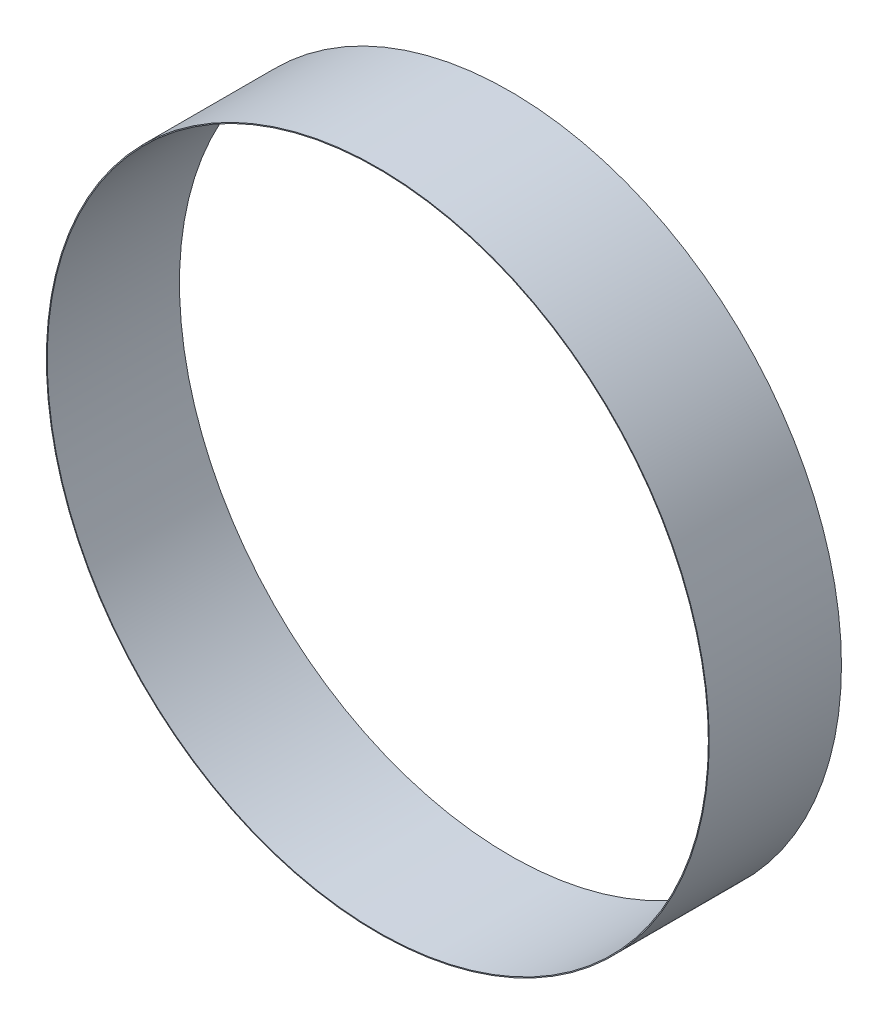
ISO-10303-21;
HEADER;
FILE_DESCRIPTION(('STEP AP214'),'2;1');
FILE_NAME('part.step','',(''),(''),'','','');
FILE_SCHEMA(('AUTOMOTIVE_DESIGN { 1 0 10303 214 1 1 1 1 }'));
ENDSEC;
DATA;
#1=APPLICATION_CONTEXT('core data for automotive mechanical design processes');
#2=APPLICATION_PROTOCOL_DEFINITION('international standard','automotive_design',2000,#1);
#3=PRODUCT_CONTEXT('',#1,'mechanical');
#4=PRODUCT('Part','Part','',(#3));
#5=PRODUCT_RELATED_PRODUCT_CATEGORY('part','',(#4));
#6=PRODUCT_DEFINITION_FORMATION('','',#4);
#7=PRODUCT_DEFINITION_CONTEXT('part definition',#1,'design');
#8=PRODUCT_DEFINITION('design','',#6,#7);
#9=PRODUCT_DEFINITION_SHAPE('','',#8);
#10=(LENGTH_UNIT() NAMED_UNIT(*) SI_UNIT(.MILLI.,.METRE.));
#11=(NAMED_UNIT(*) PLANE_ANGLE_UNIT() SI_UNIT($,.RADIAN.));
#12=(NAMED_UNIT(*) SI_UNIT($,.STERADIAN.) SOLID_ANGLE_UNIT());
#13=UNCERTAINTY_MEASURE_WITH_UNIT(LENGTH_MEASURE(1.E-05),#10,'distance_accuracy_value','');
#14=(GEOMETRIC_REPRESENTATION_CONTEXT(3) GLOBAL_UNCERTAINTY_ASSIGNED_CONTEXT((#13)) GLOBAL_UNIT_ASSIGNED_CONTEXT((#10,
#11,#12)) REPRESENTATION_CONTEXT('',''));
#15=CARTESIAN_POINT('',(0.,0.,0.));
#16=DIRECTION('',(0.,0.,1.));
#17=DIRECTION('',(1.,0.,0.));
#18=AXIS2_PLACEMENT_3D('',#15,#16,#17);
#19=CARTESIAN_POINT('',(0.,0.,30.));
#20=DIRECTION('',(0.,0.,1.));
#21=DIRECTION('',(1.,0.,0.));
#22=AXIS2_PLACEMENT_3D('',#19,#20,#21);
#23=PLANE('',#22);
#24=CARTESIAN_POINT('',(0.,0.,30.));
#25=DIRECTION('',(0.,0.,1.));
#26=DIRECTION('',(1.,0.,0.));
#27=AXIS2_PLACEMENT_3D('',#24,#25,#26);
#28=CIRCLE('',#27,75.2);
#29=CARTESIAN_POINT('',(75.2,0.,30.));
#30=VERTEX_POINT('',#29);
#31=EDGE_CURVE('E10',#30,#30,#28,.T.);
#32=ORIENTED_EDGE('',*,*,#31,.T.);
#33=EDGE_LOOP('',(#32));
#34=FACE_BOUND('',#33,.T.);
#35=CARTESIAN_POINT('',(0.,0.,30.));
#36=DIRECTION('',(0.,0.,1.));
#37=DIRECTION('',(1.,0.,0.));
#38=AXIS2_PLACEMENT_3D('',#35,#36,#37);
#39=CIRCLE('',#38,75.);
#40=CARTESIAN_POINT('',(75.,0.,30.));
#41=VERTEX_POINT('',#40);
#42=EDGE_CURVE('E52',#41,#41,#39,.T.);
#43=ORIENTED_EDGE('',*,*,#42,.F.);
#44=EDGE_LOOP('',(#43));
#45=FACE_BOUND('',#44,.T.);
#46=ADVANCED_FACE('F38',(#34,#45),#23,.T.);
#47=CARTESIAN_POINT('',(0.,0.,0.));
#48=DIRECTION('',(0.,0.,1.));
#49=DIRECTION('',(1.,0.,0.));
#50=AXIS2_PLACEMENT_3D('',#47,#48,#49);
#51=PLANE('',#50);
#52=CARTESIAN_POINT('',(0.,0.,0.));
#53=DIRECTION('',(0.,0.,1.));
#54=DIRECTION('',(1.,0.,0.));
#55=AXIS2_PLACEMENT_3D('',#52,#53,#54);
#56=CIRCLE('',#55,75.2);
#57=CARTESIAN_POINT('',(75.2,0.,0.));
#58=VERTEX_POINT('',#57);
#59=EDGE_CURVE('E42',#58,#58,#56,.T.);
#60=ORIENTED_EDGE('',*,*,#59,.F.);
#61=EDGE_LOOP('',(#60));
#62=FACE_BOUND('',#61,.T.);
#63=CARTESIAN_POINT('',(0.,0.,0.));
#64=DIRECTION('',(0.,0.,1.));
#65=DIRECTION('',(1.,0.,0.));
#66=AXIS2_PLACEMENT_3D('',#63,#64,#65);
#67=CIRCLE('',#66,75.);
#68=CARTESIAN_POINT('',(75.,0.,0.));
#69=VERTEX_POINT('',#68);
#70=EDGE_CURVE('E54',#69,#69,#67,.T.);
#71=ORIENTED_EDGE('',*,*,#70,.T.);
#72=EDGE_LOOP('',(#71));
#73=FACE_BOUND('',#72,.T.);
#74=ADVANCED_FACE('F65',(#62,#73),#51,.F.);
#75=CARTESIAN_POINT('',(0.,0.,30.));
#76=DIRECTION('',(0.,0.,-1.));
#77=DIRECTION('',(-1.,0.,0.));
#78=AXIS2_PLACEMENT_3D('',#75,#76,#77);
#79=CYLINDRICAL_SURFACE('',#78,75.2);
#80=ORIENTED_EDGE('',*,*,#31,.F.);
#81=EDGE_LOOP('',(#80));
#82=FACE_BOUND('',#81,.T.);
#83=ORIENTED_EDGE('',*,*,#59,.T.);
#84=EDGE_LOOP('',(#83));
#85=FACE_BOUND('',#84,.T.);
#86=ADVANCED_FACE('F40',(#82,#85),#79,.T.);
#87=CARTESIAN_POINT('',(0.,0.,30.));
#88=DIRECTION('',(0.,0.,-1.));
#89=DIRECTION('',(-1.,0.,0.));
#90=AXIS2_PLACEMENT_3D('',#87,#88,#89);
#91=CYLINDRICAL_SURFACE('',#90,75.);
#92=ORIENTED_EDGE('',*,*,#42,.T.);
#93=EDGE_LOOP('',(#92));
#94=FACE_BOUND('',#93,.T.);
#95=ORIENTED_EDGE('',*,*,#70,.F.);
#96=EDGE_LOOP('',(#95));
#97=FACE_BOUND('',#96,.T.);
#98=ADVANCED_FACE('F61',(#94,#97),#91,.F.);
#99=CLOSED_SHELL('',(#46,#74,#86,#98));
#100=MANIFOLD_SOLID_BREP('B2',#99);
#101=ADVANCED_BREP_SHAPE_REPRESENTATION('',(#18,#100),#14);
#102=SHAPE_DEFINITION_REPRESENTATION(#9,#101);
ENDSEC;
END-ISO-10303-21;
